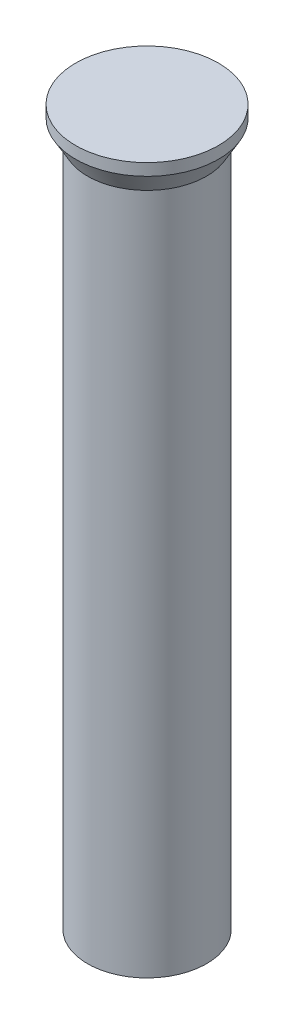
ISO-10303-21;
HEADER;
FILE_DESCRIPTION(('STEP AP214'),'2;1');
FILE_NAME('part.step','',(''),(''),'','','');
FILE_SCHEMA(('AUTOMOTIVE_DESIGN { 1 0 10303 214 1 1 1 1 }'));
ENDSEC;
DATA;
#1=APPLICATION_CONTEXT('core data for automotive mechanical design processes');
#2=APPLICATION_PROTOCOL_DEFINITION('international standard','automotive_design',2000,#1);
#3=PRODUCT_CONTEXT('',#1,'mechanical');
#4=PRODUCT('Part','Part','',(#3));
#5=PRODUCT_RELATED_PRODUCT_CATEGORY('part','',(#4));
#6=PRODUCT_DEFINITION_FORMATION('','',#4);
#7=PRODUCT_DEFINITION_CONTEXT('part definition',#1,'design');
#8=PRODUCT_DEFINITION('design','',#6,#7);
#9=PRODUCT_DEFINITION_SHAPE('','',#8);
#10=(LENGTH_UNIT() NAMED_UNIT(*) SI_UNIT(.MILLI.,.METRE.));
#11=(NAMED_UNIT(*) PLANE_ANGLE_UNIT() SI_UNIT($,.RADIAN.));
#12=(NAMED_UNIT(*) SI_UNIT($,.STERADIAN.) SOLID_ANGLE_UNIT());
#13=UNCERTAINTY_MEASURE_WITH_UNIT(LENGTH_MEASURE(1.E-05),#10,'distance_accuracy_value','');
#14=(GEOMETRIC_REPRESENTATION_CONTEXT(3) GLOBAL_UNCERTAINTY_ASSIGNED_CONTEXT((#13)) GLOBAL_UNIT_ASSIGNED_CONTEXT((#10,
#11,#12)) REPRESENTATION_CONTEXT('',''));
#15=CARTESIAN_POINT('',(0.,0.,0.));
#16=DIRECTION('',(0.,0.,1.));
#17=DIRECTION('',(1.,0.,0.));
#18=AXIS2_PLACEMENT_3D('',#15,#16,#17);
#19=CARTESIAN_POINT('',(0.,0.,0.));
#20=DIRECTION('',(0.,1.,0.));
#21=DIRECTION('',(0.,0.,1.));
#22=AXIS2_PLACEMENT_3D('',#19,#20,#21);
#23=PLANE('',#22);
#24=CARTESIAN_POINT('',(0.,0.,0.));
#25=DIRECTION('',(0.,-1.,0.));
#26=DIRECTION('',(0.,0.,-1.));
#27=AXIS2_PLACEMENT_3D('',#24,#25,#26);
#28=CIRCLE('',#27,6.);
#29=CARTESIAN_POINT('',(0.,0.,-6.));
#30=VERTEX_POINT('',#29);
#31=EDGE_CURVE('E10',#30,#30,#28,.T.);
#32=ORIENTED_EDGE('',*,*,#31,.F.);
#33=EDGE_LOOP('',(#32));
#34=FACE_BOUND('',#33,.T.);
#35=ADVANCED_FACE('F37',(#34),#23,.T.);
#36=CARTESIAN_POINT('',(0.,-65.,0.));
#37=DIRECTION('',(0.,-1.,0.));
#38=DIRECTION('',(0.,0.,-1.));
#39=AXIS2_PLACEMENT_3D('',#36,#37,#38);
#40=CYLINDRICAL_SURFACE('',#39,6.);
#41=ORIENTED_EDGE('',*,*,#31,.T.);
#42=EDGE_LOOP('',(#41));
#43=FACE_BOUND('',#42,.T.);
#44=CARTESIAN_POINT('',(0.,-1.,0.));
#45=DIRECTION('',(0.,-1.,0.));
#46=DIRECTION('',(0.,0.,-1.));
#47=AXIS2_PLACEMENT_3D('',#44,#45,#46);
#48=CIRCLE('',#47,6.);
#49=CARTESIAN_POINT('',(0.,-1.,-6.));
#50=VERTEX_POINT('',#49);
#51=EDGE_CURVE('E43',#50,#50,#48,.T.);
#52=ORIENTED_EDGE('',*,*,#51,.F.);
#53=EDGE_LOOP('',(#52));
#54=FACE_BOUND('',#53,.T.);
#55=ADVANCED_FACE('F69',(#43,#54),#40,.T.);
#56=CARTESIAN_POINT('',(0.,-2.7320508075689,0.));
#57=DIRECTION('',(0.,1.,0.));
#58=DIRECTION('',(0.,0.,1.));
#59=AXIS2_PLACEMENT_3D('',#56,#57,#58);
#60=CONICAL_SURFACE('',#59,5.,0.523598775598294);
#61=ORIENTED_EDGE('',*,*,#51,.T.);
#62=EDGE_LOOP('',(#61));
#63=FACE_BOUND('',#62,.T.);
#64=CARTESIAN_POINT('',(0.,-2.7320508075689,0.));
#65=DIRECTION('',(0.,-1.,0.));
#66=DIRECTION('',(0.,0.,-1.));
#67=AXIS2_PLACEMENT_3D('',#64,#65,#66);
#68=CIRCLE('',#67,5.);
#69=CARTESIAN_POINT('',(0.,-2.7320508075689,-5.));
#70=VERTEX_POINT('',#69);
#71=EDGE_CURVE('E47',#70,#70,#68,.T.);
#72=ORIENTED_EDGE('',*,*,#71,.F.);
#73=EDGE_LOOP('',(#72));
#74=FACE_BOUND('',#73,.T.);
#75=ADVANCED_FACE('F61',(#63,#74),#60,.T.);
#76=CARTESIAN_POINT('',(0.,-65.,0.));
#77=DIRECTION('',(0.,-1.,0.));
#78=DIRECTION('',(0.,0.,-1.));
#79=AXIS2_PLACEMENT_3D('',#76,#77,#78);
#80=CYLINDRICAL_SURFACE('',#79,5.);
#81=ORIENTED_EDGE('',*,*,#71,.T.);
#82=EDGE_LOOP('',(#81));
#83=FACE_BOUND('',#82,.T.);
#84=CARTESIAN_POINT('',(0.,-60.,0.));
#85=DIRECTION('',(0.,-1.,0.));
#86=DIRECTION('',(0.,0.,-1.));
#87=AXIS2_PLACEMENT_3D('',#84,#85,#86);
#88=CIRCLE('',#87,5.00000000000001);
#89=CARTESIAN_POINT('',(0.,-60.,-5.00000000000001));
#90=VERTEX_POINT('',#89);
#91=EDGE_CURVE('E51',#90,#90,#88,.T.);
#92=ORIENTED_EDGE('',*,*,#91,.F.);
#93=EDGE_LOOP('',(#92));
#94=FACE_BOUND('',#93,.T.);
#95=ADVANCED_FACE('F59',(#83,#94),#80,.T.);
#96=CARTESIAN_POINT('',(5.00000000000001,-60.,0.));
#97=DIRECTION('',(0.,-1.,0.));
#98=DIRECTION('',(0.,0.,-1.));
#99=AXIS2_PLACEMENT_3D('',#96,#97,#98);
#100=PLANE('',#99);
#101=ORIENTED_EDGE('',*,*,#91,.T.);
#102=EDGE_LOOP('',(#101));
#103=FACE_BOUND('',#102,.T.);
#104=ADVANCED_FACE('F57',(#103),#100,.T.);
#105=CLOSED_SHELL('',(#35,#55,#75,#95,#104));
#106=MANIFOLD_SOLID_BREP('B2',#105);
#107=ADVANCED_BREP_SHAPE_REPRESENTATION('',(#18,#106),#14);
#108=SHAPE_DEFINITION_REPRESENTATION(#9,#107);
ENDSEC;
END-ISO-10303-21;
